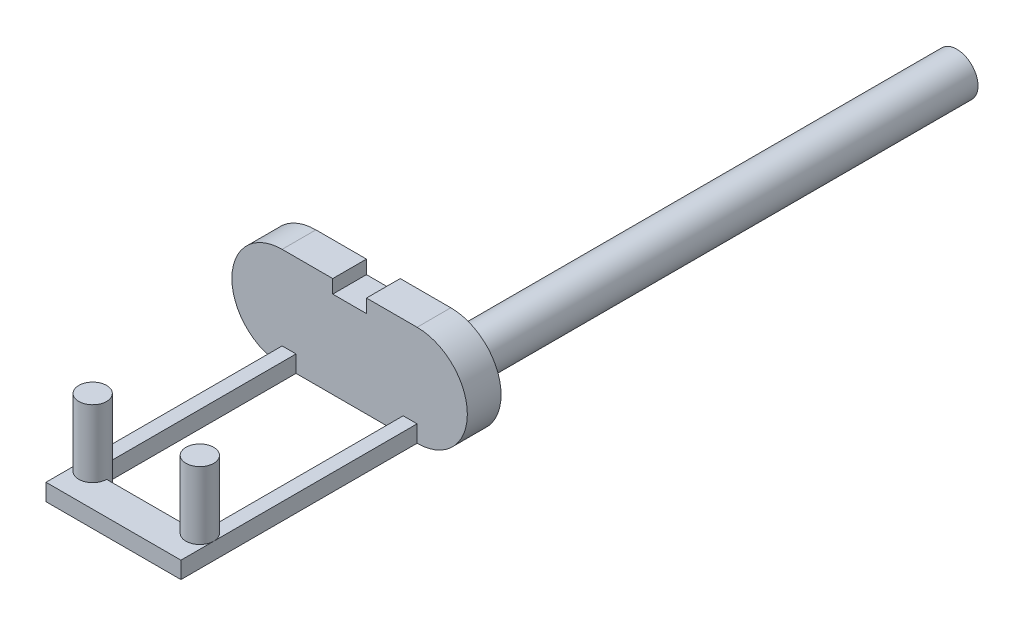
ISO-10303-21;
HEADER;
FILE_DESCRIPTION(('STEP AP214'),'2;1');
FILE_NAME('part.step','',(''),(''),'','','');
FILE_SCHEMA(('AUTOMOTIVE_DESIGN { 1 0 10303 214 1 1 1 1 }'));
ENDSEC;
DATA;
#1=APPLICATION_CONTEXT('core data for automotive mechanical design processes');
#2=APPLICATION_PROTOCOL_DEFINITION('international standard','automotive_design',2000,#1);
#3=PRODUCT_CONTEXT('',#1,'mechanical');
#4=PRODUCT('Part','Part','',(#3));
#5=PRODUCT_RELATED_PRODUCT_CATEGORY('part','',(#4));
#6=PRODUCT_DEFINITION_FORMATION('','',#4);
#7=PRODUCT_DEFINITION_CONTEXT('part definition',#1,'design');
#8=PRODUCT_DEFINITION('design','',#6,#7);
#9=PRODUCT_DEFINITION_SHAPE('','',#8);
#10=(LENGTH_UNIT() NAMED_UNIT(*) SI_UNIT(.MILLI.,.METRE.));
#11=(NAMED_UNIT(*) PLANE_ANGLE_UNIT() SI_UNIT($,.RADIAN.));
#12=(NAMED_UNIT(*) SI_UNIT($,.STERADIAN.) SOLID_ANGLE_UNIT());
#13=UNCERTAINTY_MEASURE_WITH_UNIT(LENGTH_MEASURE(1.E-05),#10,'distance_accuracy_value','');
#14=(GEOMETRIC_REPRESENTATION_CONTEXT(3) GLOBAL_UNCERTAINTY_ASSIGNED_CONTEXT((#13)) GLOBAL_UNIT_ASSIGNED_CONTEXT((#10,
#11,#12)) REPRESENTATION_CONTEXT('',''));
#15=CARTESIAN_POINT('',(0.,0.,0.));
#16=DIRECTION('',(0.,0.,1.));
#17=DIRECTION('',(1.,0.,0.));
#18=AXIS2_PLACEMENT_3D('',#15,#16,#17);
#19=CARTESIAN_POINT('',(-61.2640274636036,57.8352530805438,43.));
#20=DIRECTION('',(0.,-1.,0.));
#21=DIRECTION('',(0.,0.,-1.));
#22=AXIS2_PLACEMENT_3D('',#19,#20,#21);
#23=PLANE('',#22);
#24=DIRECTION('',(-1.,0.,0.));
#25=VECTOR('',#24,1.);
#26=CARTESIAN_POINT('',(-61.2640274636036,57.8352530805438,43.));
#27=LINE('',#26,#25);
#28=CARTESIAN_POINT('',(-73.7640274636036,57.8352530805438,43.));
#29=VERTEX_POINT('',#28);
#30=CARTESIAN_POINT('',(-81.2640274636036,57.8352530805438,43.));
#31=VERTEX_POINT('',#30);
#32=EDGE_CURVE('E187',#29,#31,#27,.T.);
#33=ORIENTED_EDGE('',*,*,#32,.F.);
#34=DIRECTION('',(0.,0.,1.));
#35=VECTOR('',#34,1.);
#36=CARTESIAN_POINT('',(-73.7640274636036,57.8352530805438,30.3857382714521));
#37=LINE('',#36,#35);
#38=CARTESIAN_POINT('',(-73.7640274636036,57.8352530805438,38.));
#39=VERTEX_POINT('',#38);
#40=EDGE_CURVE('E175',#39,#29,#37,.T.);
#41=ORIENTED_EDGE('',*,*,#40,.F.);
#42=DIRECTION('',(-1.,0.,0.));
#43=VECTOR('',#42,1.);
#44=CARTESIAN_POINT('',(-61.2640274636036,57.8352530805438,38.));
#45=LINE('',#44,#43);
#46=CARTESIAN_POINT('',(-81.2640274636036,57.8352530805438,38.));
#47=VERTEX_POINT('',#46);
#48=EDGE_CURVE('E185',#39,#47,#45,.T.);
#49=ORIENTED_EDGE('',*,*,#48,.T.);
#50=DIRECTION('',(0.,0.,-1.));
#51=VECTOR('',#50,1.);
#52=CARTESIAN_POINT('',(-81.2640274636036,57.8352530805438,43.));
#53=LINE('',#52,#51);
#54=EDGE_CURVE('E215',#31,#47,#53,.T.);
#55=ORIENTED_EDGE('',*,*,#54,.F.);
#56=EDGE_LOOP('',(#33,#41,#49,#55));
#57=FACE_BOUND('',#56,.T.);
#58=ADVANCED_FACE('F49',(#57),#23,.F.);
#59=CARTESIAN_POINT('',(0.,45.4390579258131,78.));
#60=DIRECTION('',(0.,1.,0.));
#61=DIRECTION('',(0.,0.,1.));
#62=AXIS2_PLACEMENT_3D('',#59,#60,#61);
#63=PLANE('',#62);
#64=CARTESIAN_POINT('',(-79.2048370431136,45.4390579258131,73.1394620866765));
#65=DIRECTION('',(0.,1.,0.));
#66=DIRECTION('',(0.,0.,1.));
#67=AXIS2_PLACEMENT_3D('',#64,#65,#66);
#68=CIRCLE('',#67,2.0591905457382);
#69=CARTESIAN_POINT('',(-79.2048370431136,45.4390579258131,71.0802715409383));
#70=VERTEX_POINT('',#69);
#71=CARTESIAN_POINT('',(-81.2640275888518,45.4390579258131,73.1394620866765));
#72=VERTEX_POINT('',#71);
#73=EDGE_CURVE('E347',#70,#72,#68,.T.);
#74=ORIENTED_EDGE('',*,*,#73,.F.);
#75=DIRECTION('',(0.,0.,-1.));
#76=VECTOR('',#75,1.);
#77=CARTESIAN_POINT('',(-79.2048370431136,45.4390579258131,78.));
#78=LINE('',#77,#76);
#79=CARTESIAN_POINT('',(-79.2048370431136,45.4390579258131,43.));
#80=VERTEX_POINT('',#79);
#81=EDGE_CURVE('E280',#70,#80,#78,.T.);
#82=ORIENTED_EDGE('',*,*,#81,.T.);
#83=DIRECTION('',(1.,0.,0.));
#84=VECTOR('',#83,1.);
#85=CARTESIAN_POINT('',(0.,45.4390579258131,43.));
#86=LINE('',#85,#84);
#87=CARTESIAN_POINT('',(-81.2640275888518,45.4390579258131,43.));
#88=VERTEX_POINT('',#87);
#89=EDGE_CURVE('E270',#88,#80,#86,.T.);
#90=ORIENTED_EDGE('',*,*,#89,.F.);
#91=DIRECTION('',(0.,0.,-1.));
#92=VECTOR('',#91,1.);
#93=CARTESIAN_POINT('',(-81.2640275888518,45.4390579258131,78.));
#94=LINE('',#93,#92);
#95=EDGE_CURVE('E265',#72,#88,#94,.T.);
#96=ORIENTED_EDGE('',*,*,#95,.F.);
#97=EDGE_LOOP('',(#74,#82,#90,#96));
#98=FACE_BOUND('',#97,.T.);
#99=ADVANCED_FACE('F351',(#98),#63,.T.);
#100=CARTESIAN_POINT('',(-63.3232178840935,45.4390579258131,73.1394620866765));
#101=DIRECTION('',(0.,1.,0.));
#102=DIRECTION('',(0.,0.,1.));
#103=AXIS2_PLACEMENT_3D('',#100,#101,#102);
#104=CIRCLE('',#103,2.05919054573816);
#105=CARTESIAN_POINT('',(-61.2640273383553,45.4390579258131,73.1394620866765));
#106=VERTEX_POINT('',#105);
#107=CARTESIAN_POINT('',(-63.3232178840935,45.4390579258131,71.0802715409384));
#108=VERTEX_POINT('',#107);
#109=EDGE_CURVE('E327',#106,#108,#104,.T.);
#110=ORIENTED_EDGE('',*,*,#109,.F.);
#111=DIRECTION('',(0.,0.,-1.));
#112=VECTOR('',#111,1.);
#113=CARTESIAN_POINT('',(-61.2640273383553,45.4390579258131,78.));
#114=LINE('',#113,#112);
#115=CARTESIAN_POINT('',(-61.2640273383553,45.4390579258131,43.));
#116=VERTEX_POINT('',#115);
#117=EDGE_CURVE('E302',#106,#116,#114,.T.);
#118=ORIENTED_EDGE('',*,*,#117,.T.);
#119=DIRECTION('',(1.,0.,0.));
#120=VECTOR('',#119,1.);
#121=CARTESIAN_POINT('',(0.,45.4390579258131,43.));
#122=LINE('',#121,#120);
#123=CARTESIAN_POINT('',(-63.3232178840935,45.4390579258131,43.));
#124=VERTEX_POINT('',#123);
#125=EDGE_CURVE('E288',#124,#116,#122,.T.);
#126=ORIENTED_EDGE('',*,*,#125,.F.);
#127=DIRECTION('',(0.,0.,-1.));
#128=VECTOR('',#127,1.);
#129=CARTESIAN_POINT('',(-63.3232178840935,45.4390579258131,78.));
#130=LINE('',#129,#128);
#131=EDGE_CURVE('E293',#108,#124,#130,.T.);
#132=ORIENTED_EDGE('',*,*,#131,.F.);
#133=EDGE_LOOP('',(#110,#118,#126,#132));
#134=FACE_BOUND('',#133,.T.);
#135=ADVANCED_FACE('F326',(#134),#63,.T.);
#136=CARTESIAN_POINT('',(-61.2640274636036,50.3871555031784,43.));
#137=DIRECTION('',(0.,0.,1.));
#138=DIRECTION('',(1.,0.,0.));
#139=AXIS2_PLACEMENT_3D('',#136,#137,#138);
#140=PLANE('',#139);
#141=DIRECTION('',(0.,-1.,0.));
#142=VECTOR('',#141,1.);
#143=CARTESIAN_POINT('',(-73.7640274636036,50.3871555031784,43.));
#144=LINE('',#143,#142);
#145=CARTESIAN_POINT('',(-73.7640274636036,55.8352530805438,43.));
#146=VERTEX_POINT('',#145);
#147=EDGE_CURVE('E375',#29,#146,#144,.T.);
#148=ORIENTED_EDGE('',*,*,#147,.F.);
#149=ORIENTED_EDGE('',*,*,#32,.T.);
#150=CARTESIAN_POINT('',(-81.2640274636036,50.3871555031784,43.));
#151=DIRECTION('',(0.,0.,1.));
#152=DIRECTION('',(1.,0.,0.));
#153=AXIS2_PLACEMENT_3D('',#150,#151,#152);
#154=CIRCLE('',#153,7.44809757736534);
#155=CARTESIAN_POINT('',(-81.2640274636036,42.9390579258131,43.));
#156=VERTEX_POINT('',#155);
#157=EDGE_CURVE('E256',#31,#156,#154,.T.);
#158=ORIENTED_EDGE('',*,*,#157,.T.);
#159=DIRECTION('',(0.,1.,0.));
#160=VECTOR('',#159,1.);
#161=CARTESIAN_POINT('',(-81.2640275888518,0.,43.));
#162=LINE('',#161,#160);
#163=EDGE_CURVE('E259',#156,#88,#162,.T.);
#164=ORIENTED_EDGE('',*,*,#163,.T.);
#165=ORIENTED_EDGE('',*,*,#89,.T.);
#166=DIRECTION('',(0.,1.,0.));
#167=VECTOR('',#166,1.);
#168=CARTESIAN_POINT('',(-79.2048370431136,0.,43.));
#169=LINE('',#168,#167);
#170=CARTESIAN_POINT('',(-79.2048370431136,42.9390579258131,43.));
#171=VERTEX_POINT('',#170);
#172=EDGE_CURVE('E273',#171,#80,#169,.T.);
#173=ORIENTED_EDGE('',*,*,#172,.F.);
#174=DIRECTION('',(1.,0.,0.));
#175=VECTOR('',#174,1.);
#176=CARTESIAN_POINT('',(-61.2640274636036,42.9390579258131,43.));
#177=LINE('',#176,#175);
#178=CARTESIAN_POINT('',(-63.3232178840935,42.9390579258131,43.));
#179=VERTEX_POINT('',#178);
#180=EDGE_CURVE('E212',#171,#179,#177,.T.);
#181=ORIENTED_EDGE('',*,*,#180,.T.);
#182=DIRECTION('',(0.,1.,0.));
#183=VECTOR('',#182,1.);
#184=CARTESIAN_POINT('',(-63.3232178840935,0.,43.));
#185=LINE('',#184,#183);
#186=EDGE_CURVE('E284',#179,#124,#185,.T.);
#187=ORIENTED_EDGE('',*,*,#186,.T.);
#188=ORIENTED_EDGE('',*,*,#125,.T.);
#189=DIRECTION('',(0.,1.,0.));
#190=VECTOR('',#189,1.);
#191=CARTESIAN_POINT('',(-61.2640273383553,0.,43.));
#192=LINE('',#191,#190);
#193=CARTESIAN_POINT('',(-61.2640274636036,42.9390579258131,43.));
#194=VERTEX_POINT('',#193);
#195=EDGE_CURVE('E296',#194,#116,#192,.T.);
#196=ORIENTED_EDGE('',*,*,#195,.F.);
#197=CARTESIAN_POINT('',(-61.2640274636036,50.3871555031784,43.));
#198=DIRECTION('',(0.,0.,1.));
#199=DIRECTION('',(1.,0.,0.));
#200=AXIS2_PLACEMENT_3D('',#197,#198,#199);
#201=CIRCLE('',#200,7.44809757736534);
#202=CARTESIAN_POINT('',(-61.2640274636036,57.8352530805438,43.));
#203=VERTEX_POINT('',#202);
#204=EDGE_CURVE('E207',#194,#203,#201,.T.);
#205=ORIENTED_EDGE('',*,*,#204,.T.);
#206=CARTESIAN_POINT('',(-68.7640274636036,57.8352530805438,43.));
#207=VERTEX_POINT('',#206);
#208=EDGE_CURVE('E239',#203,#207,#27,.T.);
#209=ORIENTED_EDGE('',*,*,#208,.T.);
#210=DIRECTION('',(0.,1.,0.));
#211=VECTOR('',#210,1.);
#212=CARTESIAN_POINT('',(-68.7640274636036,50.3871555031784,43.));
#213=LINE('',#212,#211);
#214=CARTESIAN_POINT('',(-68.7640274636036,55.8352530805438,43.));
#215=VERTEX_POINT('',#214);
#216=EDGE_CURVE('E377',#215,#207,#213,.T.);
#217=ORIENTED_EDGE('',*,*,#216,.F.);
#218=DIRECTION('',(1.,0.,0.));
#219=VECTOR('',#218,1.);
#220=CARTESIAN_POINT('',(-61.2640274636036,55.8352530805438,43.));
#221=LINE('',#220,#219);
#222=EDGE_CURVE('E379',#146,#215,#221,.T.);
#223=ORIENTED_EDGE('',*,*,#222,.F.);
#224=EDGE_LOOP('',(#148,#149,#158,#164,#165,#173,#181,#187,#188,#196,#205,#209,#217,#223));
#225=FACE_BOUND('',#224,.T.);
#226=ADVANCED_FACE('F315',(#225),#140,.T.);
#227=CARTESIAN_POINT('',(-61.2640274636036,50.3871555031784,38.));
#228=DIRECTION('',(0.,0.,-1.));
#229=DIRECTION('',(-1.,0.,0.));
#230=AXIS2_PLACEMENT_3D('',#227,#228,#229);
#231=CYLINDRICAL_SURFACE('',#230,3.13544056145611);
#232=CARTESIAN_POINT('',(-61.2640274636036,50.3871555031784,38.));
#233=DIRECTION('',(0.,0.,1.));
#234=DIRECTION('',(1.,0.,0.));
#235=AXIS2_PLACEMENT_3D('',#232,#233,#234);
#236=CIRCLE('',#235,3.13544056145611);
#237=CARTESIAN_POINT('',(-58.1285869021474,50.3871555031784,38.));
#238=VERTEX_POINT('',#237);
#239=EDGE_CURVE('E223',#238,#238,#236,.T.);
#240=ORIENTED_EDGE('',*,*,#239,.F.);
#241=EDGE_LOOP('',(#240));
#242=FACE_BOUND('',#241,.T.);
#243=CARTESIAN_POINT('',(-61.2640274636036,50.3871555031784,-37.));
#244=DIRECTION('',(0.,0.,1.));
#245=DIRECTION('',(1.,0.,0.));
#246=AXIS2_PLACEMENT_3D('',#243,#244,#245);
#247=CIRCLE('',#246,3.13544056145611);
#248=CARTESIAN_POINT('',(-58.1285869021474,50.3871555031784,-37.));
#249=VERTEX_POINT('',#248);
#250=EDGE_CURVE('E220',#249,#249,#247,.T.);
#251=ORIENTED_EDGE('',*,*,#250,.T.);
#252=EDGE_LOOP('',(#251));
#253=FACE_BOUND('',#252,.T.);
#254=ADVANCED_FACE('F51',(#242,#253),#231,.T.);
#255=CARTESIAN_POINT('',(-61.2640274636036,50.3871555031784,-37.));
#256=DIRECTION('',(0.,0.,1.));
#257=DIRECTION('',(1.,0.,0.));
#258=AXIS2_PLACEMENT_3D('',#255,#256,#257);
#259=PLANE('',#258);
#260=ORIENTED_EDGE('',*,*,#250,.F.);
#261=EDGE_LOOP('',(#260));
#262=FACE_BOUND('',#261,.T.);
#263=ADVANCED_FACE('F409',(#262),#259,.F.);
#264=CARTESIAN_POINT('',(-61.2640274636036,50.3871555031784,43.));
#265=DIRECTION('',(0.,0.,-1.));
#266=DIRECTION('',(-1.,0.,0.));
#267=AXIS2_PLACEMENT_3D('',#264,#265,#266);
#268=CYLINDRICAL_SURFACE('',#267,7.44809757736534);
#269=CARTESIAN_POINT('',(-61.2640274636036,50.3871555031784,38.));
#270=DIRECTION('',(0.,0.,1.));
#271=DIRECTION('',(1.,0.,0.));
#272=AXIS2_PLACEMENT_3D('',#269,#270,#271);
#273=CIRCLE('',#272,7.44809757736534);
#274=CARTESIAN_POINT('',(-61.2640274636036,42.9390579258131,38.));
#275=VERTEX_POINT('',#274);
#276=CARTESIAN_POINT('',(-61.2640274636036,57.8352530805438,38.));
#277=VERTEX_POINT('',#276);
#278=EDGE_CURVE('E196',#275,#277,#273,.T.);
#279=ORIENTED_EDGE('',*,*,#278,.T.);
#280=DIRECTION('',(0.,0.,-1.));
#281=VECTOR('',#280,1.);
#282=CARTESIAN_POINT('',(-61.2640274636036,57.8352530805438,43.));
#283=LINE('',#282,#281);
#284=EDGE_CURVE('E217',#203,#277,#283,.T.);
#285=ORIENTED_EDGE('',*,*,#284,.F.);
#286=ORIENTED_EDGE('',*,*,#204,.F.);
#287=DIRECTION('',(0.,0.,-1.));
#288=VECTOR('',#287,1.);
#289=CARTESIAN_POINT('',(-61.2640274636036,42.9390579258131,43.));
#290=LINE('',#289,#288);
#291=EDGE_CURVE('E208',#194,#275,#290,.T.);
#292=ORIENTED_EDGE('',*,*,#291,.T.);
#293=EDGE_LOOP('',(#279,#285,#286,#292));
#294=FACE_BOUND('',#293,.T.);
#295=ADVANCED_FACE('F243',(#294),#268,.T.);
#296=CARTESIAN_POINT('',(-68.7640274636036,57.8352530805438,38.));
#297=VERTEX_POINT('',#296);
#298=EDGE_CURVE('E195',#277,#297,#45,.T.);
#299=ORIENTED_EDGE('',*,*,#298,.T.);
#300=DIRECTION('',(0.,0.,-1.));
#301=VECTOR('',#300,1.);
#302=CARTESIAN_POINT('',(-68.7640274636036,57.8352530805438,30.3857382714521));
#303=LINE('',#302,#301);
#304=EDGE_CURVE('E188',#207,#297,#303,.T.);
#305=ORIENTED_EDGE('',*,*,#304,.F.);
#306=ORIENTED_EDGE('',*,*,#208,.F.);
#307=ORIENTED_EDGE('',*,*,#284,.T.);
#308=EDGE_LOOP('',(#299,#305,#306,#307));
#309=FACE_BOUND('',#308,.T.);
#310=ADVANCED_FACE('F236',(#309),#23,.F.);
#311=CARTESIAN_POINT('',(-81.2640274636036,50.3871555031784,43.));
#312=DIRECTION('',(0.,0.,-1.));
#313=DIRECTION('',(-1.,0.,0.));
#314=AXIS2_PLACEMENT_3D('',#311,#312,#313);
#315=CYLINDRICAL_SURFACE('',#314,7.44809757736534);
#316=CARTESIAN_POINT('',(-81.2640274636036,50.3871555031784,38.));
#317=DIRECTION('',(0.,0.,1.));
#318=DIRECTION('',(1.,0.,0.));
#319=AXIS2_PLACEMENT_3D('',#316,#317,#318);
#320=CIRCLE('',#319,7.44809757736534);
#321=CARTESIAN_POINT('',(-81.2640274636036,42.9390579258131,38.));
#322=VERTEX_POINT('',#321);
#323=EDGE_CURVE('E194',#47,#322,#320,.T.);
#324=ORIENTED_EDGE('',*,*,#323,.T.);
#325=DIRECTION('',(0.,0.,-1.));
#326=VECTOR('',#325,1.);
#327=CARTESIAN_POINT('',(-81.2640274636036,42.9390579258131,43.));
#328=LINE('',#327,#326);
#329=EDGE_CURVE('E211',#156,#322,#328,.T.);
#330=ORIENTED_EDGE('',*,*,#329,.F.);
#331=ORIENTED_EDGE('',*,*,#157,.F.);
#332=ORIENTED_EDGE('',*,*,#54,.T.);
#333=EDGE_LOOP('',(#324,#330,#331,#332));
#334=FACE_BOUND('',#333,.T.);
#335=ADVANCED_FACE('F255',(#334),#315,.T.);
#336=CARTESIAN_POINT('',(-61.2640274636036,42.9390579258131,43.));
#337=DIRECTION('',(0.,1.,0.));
#338=DIRECTION('',(0.,0.,1.));
#339=AXIS2_PLACEMENT_3D('',#336,#337,#338);
#340=PLANE('',#339);
#341=DIRECTION('',(0.,0.,-1.));
#342=VECTOR('',#341,1.);
#343=CARTESIAN_POINT('',(-81.2640274636036,42.9390579258131,78.));
#344=LINE('',#343,#342);
#345=CARTESIAN_POINT('',(-81.2640274636036,42.9390579258131,78.));
#346=VERTEX_POINT('',#345);
#347=EDGE_CURVE('E250',#346,#156,#344,.T.);
#348=ORIENTED_EDGE('',*,*,#347,.T.);
#349=ORIENTED_EDGE('',*,*,#329,.T.);
#350=DIRECTION('',(1.,0.,0.));
#351=VECTOR('',#350,1.);
#352=CARTESIAN_POINT('',(-61.2640274636036,42.9390579258131,38.));
#353=LINE('',#352,#351);
#354=EDGE_CURVE('E205',#322,#275,#353,.T.);
#355=ORIENTED_EDGE('',*,*,#354,.T.);
#356=ORIENTED_EDGE('',*,*,#291,.F.);
#357=DIRECTION('',(0.,0.,-1.));
#358=VECTOR('',#357,1.);
#359=CARTESIAN_POINT('',(-61.2640274636036,42.9390579258131,78.));
#360=LINE('',#359,#358);
#361=CARTESIAN_POINT('',(-61.2640274636036,42.9390579258131,78.));
#362=VERTEX_POINT('',#361);
#363=EDGE_CURVE('E306',#362,#194,#360,.T.);
#364=ORIENTED_EDGE('',*,*,#363,.F.);
#365=DIRECTION('',(1.,0.,0.));
#366=VECTOR('',#365,1.);
#367=CARTESIAN_POINT('',(0.,42.9390579258131,78.));
#368=LINE('',#367,#366);
#369=EDGE_CURVE('E285',#346,#362,#368,.T.);
#370=ORIENTED_EDGE('',*,*,#369,.F.);
#371=EDGE_LOOP('',(#348,#349,#355,#356,#364,#370));
#372=FACE_BOUND('',#371,.T.);
#373=DIRECTION('',(0.,0.,-1.));
#374=VECTOR('',#373,1.);
#375=CARTESIAN_POINT('',(-79.2048370431136,42.9390579258131,78.));
#376=LINE('',#375,#374);
#377=CARTESIAN_POINT('',(-79.2048370431136,42.9390579258131,71.0802715409383));
#378=VERTEX_POINT('',#377);
#379=EDGE_CURVE('E282',#378,#171,#376,.T.);
#380=ORIENTED_EDGE('',*,*,#379,.F.);
#381=CARTESIAN_POINT('',(-79.2048370431136,42.9390579258131,73.1394620866765));
#382=DIRECTION('',(0.,1.,0.));
#383=DIRECTION('',(0.,0.,1.));
#384=AXIS2_PLACEMENT_3D('',#381,#382,#383);
#385=CIRCLE('',#384,2.0591905457382);
#386=CARTESIAN_POINT('',(-77.1456464973754,42.9390579258131,73.1394620866765));
#387=VERTEX_POINT('',#386);
#388=EDGE_CURVE('E72',#378,#387,#385,.F.);
#389=ORIENTED_EDGE('',*,*,#388,.T.);
#390=DIRECTION('',(1.,0.,0.));
#391=VECTOR('',#390,1.);
#392=CARTESIAN_POINT('',(-61.2640273383553,42.9390579258131,73.1394620866765));
#393=LINE('',#392,#391);
#394=CARTESIAN_POINT('',(-65.3824084298317,42.9390579258131,73.1394620866765));
#395=VERTEX_POINT('',#394);
#396=EDGE_CURVE('E356',#387,#395,#393,.T.);
#397=ORIENTED_EDGE('',*,*,#396,.T.);
#398=CARTESIAN_POINT('',(-63.3232178840935,42.9390579258131,73.1394620866765));
#399=DIRECTION('',(0.,1.,0.));
#400=DIRECTION('',(0.,0.,1.));
#401=AXIS2_PLACEMENT_3D('',#398,#399,#400);
#402=CIRCLE('',#401,2.05919054573816);
#403=CARTESIAN_POINT('',(-63.3232178840935,42.9390579258131,71.0802715409384));
#404=VERTEX_POINT('',#403);
#405=EDGE_CURVE('E363',#395,#404,#402,.F.);
#406=ORIENTED_EDGE('',*,*,#405,.T.);
#407=DIRECTION('',(0.,0.,-1.));
#408=VECTOR('',#407,1.);
#409=CARTESIAN_POINT('',(-63.3232178840935,42.9390579258131,78.));
#410=LINE('',#409,#408);
#411=EDGE_CURVE('E200',#404,#179,#410,.T.);
#412=ORIENTED_EDGE('',*,*,#411,.T.);
#413=ORIENTED_EDGE('',*,*,#180,.F.);
#414=EDGE_LOOP('',(#380,#389,#397,#406,#412,#413));
#415=FACE_BOUND('',#414,.T.);
#416=ADVANCED_FACE('F246',(#372,#415),#340,.F.);
#417=CARTESIAN_POINT('',(-61.2640274636036,50.3871555031784,38.));
#418=DIRECTION('',(0.,0.,1.));
#419=DIRECTION('',(1.,0.,0.));
#420=AXIS2_PLACEMENT_3D('',#417,#418,#419);
#421=PLANE('',#420);
#422=ORIENTED_EDGE('',*,*,#48,.F.);
#423=DIRECTION('',(0.,-1.,0.));
#424=VECTOR('',#423,1.);
#425=CARTESIAN_POINT('',(-73.7640274636036,50.3871555031784,38.));
#426=LINE('',#425,#424);
#427=CARTESIAN_POINT('',(-73.7640274636036,55.8352530805438,38.));
#428=VERTEX_POINT('',#427);
#429=EDGE_CURVE('E13',#39,#428,#426,.T.);
#430=ORIENTED_EDGE('',*,*,#429,.T.);
#431=DIRECTION('',(1.,0.,0.));
#432=VECTOR('',#431,1.);
#433=CARTESIAN_POINT('',(-61.2640274636036,55.8352530805438,38.));
#434=LINE('',#433,#432);
#435=CARTESIAN_POINT('',(-68.7640274636036,55.8352530805438,38.));
#436=VERTEX_POINT('',#435);
#437=EDGE_CURVE('E230',#428,#436,#434,.T.);
#438=ORIENTED_EDGE('',*,*,#437,.T.);
#439=DIRECTION('',(0.,1.,0.));
#440=VECTOR('',#439,1.);
#441=CARTESIAN_POINT('',(-68.7640274636036,50.3871555031784,38.));
#442=LINE('',#441,#440);
#443=EDGE_CURVE('E57',#436,#297,#442,.T.);
#444=ORIENTED_EDGE('',*,*,#443,.T.);
#445=ORIENTED_EDGE('',*,*,#298,.F.);
#446=ORIENTED_EDGE('',*,*,#278,.F.);
#447=ORIENTED_EDGE('',*,*,#354,.F.);
#448=ORIENTED_EDGE('',*,*,#323,.F.);
#449=EDGE_LOOP('',(#422,#430,#438,#444,#445,#446,#447,#448));
#450=FACE_BOUND('',#449,.T.);
#451=ORIENTED_EDGE('',*,*,#239,.T.);
#452=EDGE_LOOP('',(#451));
#453=FACE_BOUND('',#452,.T.);
#454=ADVANCED_FACE('F191',(#450,#453),#421,.F.);
#455=CARTESIAN_POINT('',(-63.3232178840935,0.,78.));
#456=DIRECTION('',(-1.,0.,0.));
#457=DIRECTION('',(0.,0.,1.));
#458=AXIS2_PLACEMENT_3D('',#455,#456,#457);
#459=PLANE('',#458);
#460=DIRECTION('',(0.,1.,0.));
#461=VECTOR('',#460,1.);
#462=CARTESIAN_POINT('',(-63.3232178840935,37.1147875312263,71.0802715409384));
#463=LINE('',#462,#461);
#464=EDGE_CURVE('E323',#108,#404,#463,.F.);
#465=ORIENTED_EDGE('',*,*,#464,.F.);
#466=ORIENTED_EDGE('',*,*,#131,.T.);
#467=ORIENTED_EDGE('',*,*,#186,.F.);
#468=ORIENTED_EDGE('',*,*,#411,.F.);
#469=EDGE_LOOP('',(#465,#466,#467,#468));
#470=FACE_BOUND('',#469,.T.);
#471=ADVANCED_FACE('F321',(#470),#459,.T.);
#472=CARTESIAN_POINT('',(-61.2640273383553,0.,78.));
#473=DIRECTION('',(-1.,0.,0.));
#474=DIRECTION('',(0.,0.,1.));
#475=AXIS2_PLACEMENT_3D('',#472,#473,#474);
#476=PLANE('',#475);
#477=ORIENTED_EDGE('',*,*,#363,.T.);
#478=ORIENTED_EDGE('',*,*,#195,.T.);
#479=ORIENTED_EDGE('',*,*,#117,.F.);
#480=CARTESIAN_POINT('',(-61.2640273383553,45.4390579258131,78.));
#481=VERTEX_POINT('',#480);
#482=EDGE_CURVE('E303',#481,#106,#114,.T.);
#483=ORIENTED_EDGE('',*,*,#482,.F.);
#484=DIRECTION('',(0.,1.,0.));
#485=VECTOR('',#484,1.);
#486=CARTESIAN_POINT('',(-61.2640273383553,0.,78.));
#487=LINE('',#486,#485);
#488=EDGE_CURVE('E287',#362,#481,#487,.T.);
#489=ORIENTED_EDGE('',*,*,#488,.F.);
#490=EDGE_LOOP('',(#477,#478,#479,#483,#489));
#491=FACE_BOUND('',#490,.T.);
#492=ADVANCED_FACE('F331',(#491),#476,.F.);
#493=CARTESIAN_POINT('',(-77.1456464973754,45.4390579258131,73.1394620866765));
#494=VERTEX_POINT('',#493);
#495=EDGE_CURVE('E341',#72,#494,#68,.T.);
#496=ORIENTED_EDGE('',*,*,#495,.F.);
#497=CARTESIAN_POINT('',(-81.2640275888518,45.4390579258131,78.));
#498=VERTEX_POINT('',#497);
#499=EDGE_CURVE('E278',#498,#72,#94,.T.);
#500=ORIENTED_EDGE('',*,*,#499,.F.);
#501=DIRECTION('',(1.,0.,0.));
#502=VECTOR('',#501,1.);
#503=CARTESIAN_POINT('',(0.,45.4390579258131,78.));
#504=LINE('',#503,#502);
#505=EDGE_CURVE('E290',#498,#481,#504,.T.);
#506=ORIENTED_EDGE('',*,*,#505,.T.);
#507=ORIENTED_EDGE('',*,*,#482,.T.);
#508=CARTESIAN_POINT('',(-65.3824084298317,45.4390579258131,73.1394620866765));
#509=VERTEX_POINT('',#508);
#510=EDGE_CURVE('E361',#509,#106,#104,.T.);
#511=ORIENTED_EDGE('',*,*,#510,.F.);
#512=DIRECTION('',(-1.,0.,0.));
#513=VECTOR('',#512,1.);
#514=CARTESIAN_POINT('',(-61.2640273383553,45.4390579258131,73.1394620866765));
#515=LINE('',#514,#513);
#516=EDGE_CURVE('E344',#509,#494,#515,.T.);
#517=ORIENTED_EDGE('',*,*,#516,.T.);
#518=EDGE_LOOP('',(#496,#500,#506,#507,#511,#517));
#519=FACE_BOUND('',#518,.T.);
#520=ADVANCED_FACE('F339',(#519),#63,.T.);
#521=CARTESIAN_POINT('',(0.,0.,78.));
#522=DIRECTION('',(0.,0.,1.));
#523=DIRECTION('',(1.,0.,0.));
#524=AXIS2_PLACEMENT_3D('',#521,#522,#523);
#525=PLANE('',#524);
#526=ORIENTED_EDGE('',*,*,#505,.F.);
#527=DIRECTION('',(0.,1.,0.));
#528=VECTOR('',#527,1.);
#529=CARTESIAN_POINT('',(-81.2640275888518,0.,78.));
#530=LINE('',#529,#528);
#531=EDGE_CURVE('E269',#346,#498,#530,.T.);
#532=ORIENTED_EDGE('',*,*,#531,.F.);
#533=ORIENTED_EDGE('',*,*,#369,.T.);
#534=ORIENTED_EDGE('',*,*,#488,.T.);
#535=EDGE_LOOP('',(#526,#532,#533,#534));
#536=FACE_BOUND('',#535,.T.);
#537=ADVANCED_FACE('F335',(#536),#525,.T.);
#538=CARTESIAN_POINT('',(-79.2048370431136,0.,78.));
#539=DIRECTION('',(-1.,0.,0.));
#540=DIRECTION('',(0.,0.,1.));
#541=AXIS2_PLACEMENT_3D('',#538,#539,#540);
#542=PLANE('',#541);
#543=ORIENTED_EDGE('',*,*,#81,.F.);
#544=DIRECTION('',(0.,1.,0.));
#545=VECTOR('',#544,1.);
#546=CARTESIAN_POINT('',(-79.2048370431136,37.1147875312263,71.0802715409383));
#547=LINE('',#546,#545);
#548=EDGE_CURVE('E369',#70,#378,#547,.F.);
#549=ORIENTED_EDGE('',*,*,#548,.T.);
#550=ORIENTED_EDGE('',*,*,#379,.T.);
#551=ORIENTED_EDGE('',*,*,#172,.T.);
#552=EDGE_LOOP('',(#543,#549,#550,#551));
#553=FACE_BOUND('',#552,.T.);
#554=ADVANCED_FACE('F354',(#553),#542,.F.);
#555=CARTESIAN_POINT('',(-81.2640275888518,0.,78.));
#556=DIRECTION('',(-1.,0.,0.));
#557=DIRECTION('',(0.,0.,1.));
#558=AXIS2_PLACEMENT_3D('',#555,#556,#557);
#559=PLANE('',#558);
#560=ORIENTED_EDGE('',*,*,#499,.T.);
#561=ORIENTED_EDGE('',*,*,#95,.T.);
#562=ORIENTED_EDGE('',*,*,#163,.F.);
#563=ORIENTED_EDGE('',*,*,#347,.F.);
#564=ORIENTED_EDGE('',*,*,#531,.T.);
#565=EDGE_LOOP('',(#560,#561,#562,#563,#564));
#566=FACE_BOUND('',#565,.T.);
#567=ADVANCED_FACE('F261',(#566),#559,.T.);
#568=CARTESIAN_POINT('',(-61.2640273383553,22.3569093784259,73.1394620866765));
#569=DIRECTION('',(0.,0.,-1.));
#570=DIRECTION('',(-1.,0.,0.));
#571=AXIS2_PLACEMENT_3D('',#568,#569,#570);
#572=PLANE('',#571);
#573=DIRECTION('',(0.,1.,0.));
#574=VECTOR('',#573,1.);
#575=CARTESIAN_POINT('',(-77.1456464973754,37.1147875312263,73.1394620866765));
#576=LINE('',#575,#574);
#577=EDGE_CURVE('E228',#494,#387,#576,.F.);
#578=ORIENTED_EDGE('',*,*,#577,.F.);
#579=ORIENTED_EDGE('',*,*,#516,.F.);
#580=DIRECTION('',(0.,1.,0.));
#581=VECTOR('',#580,1.);
#582=CARTESIAN_POINT('',(-65.3824084298317,37.1147875312263,73.1394620866765));
#583=LINE('',#582,#581);
#584=EDGE_CURVE('E226',#395,#509,#583,.T.);
#585=ORIENTED_EDGE('',*,*,#584,.F.);
#586=ORIENTED_EDGE('',*,*,#396,.F.);
#587=EDGE_LOOP('',(#578,#579,#585,#586));
#588=FACE_BOUND('',#587,.T.);
#589=ADVANCED_FACE('F443',(#588),#572,.T.);
#590=CARTESIAN_POINT('',(-63.3232178840935,37.1147875312263,73.1394620866765));
#591=DIRECTION('',(0.,1.,0.));
#592=DIRECTION('',(0.,0.,1.));
#593=AXIS2_PLACEMENT_3D('',#590,#591,#592);
#594=CYLINDRICAL_SURFACE('',#593,2.05919054573816);
#595=ORIENTED_EDGE('',*,*,#109,.T.);
#596=ORIENTED_EDGE('',*,*,#464,.T.);
#597=ORIENTED_EDGE('',*,*,#405,.F.);
#598=ORIENTED_EDGE('',*,*,#584,.T.);
#599=ORIENTED_EDGE('',*,*,#510,.T.);
#600=EDGE_LOOP('',(#595,#596,#597,#598,#599));
#601=FACE_BOUND('',#600,.T.);
#602=CARTESIAN_POINT('',(-63.3232178840935,55.4390579258131,73.1394620866765));
#603=DIRECTION('',(0.,1.,0.));
#604=DIRECTION('',(0.,0.,1.));
#605=AXIS2_PLACEMENT_3D('',#602,#603,#604);
#606=CIRCLE('',#605,2.05919054573816);
#607=CARTESIAN_POINT('',(-63.3232178840935,55.4390579258131,75.1986526324147));
#608=VERTEX_POINT('',#607);
#609=EDGE_CURVE('E366',#608,#608,#606,.T.);
#610=ORIENTED_EDGE('',*,*,#609,.F.);
#611=EDGE_LOOP('',(#610));
#612=FACE_BOUND('',#611,.T.);
#613=ADVANCED_FACE('F446',(#601,#612),#594,.T.);
#614=CARTESIAN_POINT('',(-63.3232178840935,55.4390579258131,73.1394620866765));
#615=DIRECTION('',(0.,1.,0.));
#616=DIRECTION('',(0.,0.,1.));
#617=AXIS2_PLACEMENT_3D('',#614,#615,#616);
#618=PLANE('',#617);
#619=ORIENTED_EDGE('',*,*,#609,.T.);
#620=EDGE_LOOP('',(#619));
#621=FACE_BOUND('',#620,.T.);
#622=ADVANCED_FACE('F450',(#621),#618,.T.);
#623=CARTESIAN_POINT('',(-79.2048370431136,37.1147875312263,73.1394620866765));
#624=DIRECTION('',(0.,1.,0.));
#625=DIRECTION('',(0.,0.,1.));
#626=AXIS2_PLACEMENT_3D('',#623,#624,#625);
#627=CYLINDRICAL_SURFACE('',#626,2.0591905457382);
#628=CARTESIAN_POINT('',(-79.2048370431136,55.4390579258131,73.1394620866765));
#629=DIRECTION('',(0.,1.,0.));
#630=DIRECTION('',(0.,0.,1.));
#631=AXIS2_PLACEMENT_3D('',#628,#629,#630);
#632=CIRCLE('',#631,2.0591905457382);
#633=CARTESIAN_POINT('',(-79.2048370431136,55.4390579258131,75.1986526324147));
#634=VERTEX_POINT('',#633);
#635=EDGE_CURVE('E372',#634,#634,#632,.T.);
#636=ORIENTED_EDGE('',*,*,#635,.F.);
#637=EDGE_LOOP('',(#636));
#638=FACE_BOUND('',#637,.T.);
#639=ORIENTED_EDGE('',*,*,#548,.F.);
#640=ORIENTED_EDGE('',*,*,#73,.T.);
#641=ORIENTED_EDGE('',*,*,#495,.T.);
#642=ORIENTED_EDGE('',*,*,#577,.T.);
#643=ORIENTED_EDGE('',*,*,#388,.F.);
#644=EDGE_LOOP('',(#639,#640,#641,#642,#643));
#645=FACE_BOUND('',#644,.T.);
#646=ADVANCED_FACE('F454',(#638,#645),#627,.T.);
#647=CARTESIAN_POINT('',(-79.2048370431136,55.4390579258131,73.1394620866765));
#648=DIRECTION('',(0.,1.,0.));
#649=DIRECTION('',(0.,0.,1.));
#650=AXIS2_PLACEMENT_3D('',#647,#648,#649);
#651=PLANE('',#650);
#652=ORIENTED_EDGE('',*,*,#635,.T.);
#653=EDGE_LOOP('',(#652));
#654=FACE_BOUND('',#653,.T.);
#655=ADVANCED_FACE('F394',(#654),#651,.T.);
#656=CARTESIAN_POINT('',(-73.7640274636036,55.8352530805438,30.3857382714521));
#657=DIRECTION('',(-1.,0.,0.));
#658=DIRECTION('',(0.,0.,1.));
#659=AXIS2_PLACEMENT_3D('',#656,#657,#658);
#660=PLANE('',#659);
#661=ORIENTED_EDGE('',*,*,#147,.T.);
#662=DIRECTION('',(0.,0.,1.));
#663=VECTOR('',#662,1.);
#664=CARTESIAN_POINT('',(-73.7640274636036,55.8352530805438,30.3857382714521));
#665=LINE('',#664,#663);
#666=EDGE_CURVE('E178',#428,#146,#665,.T.);
#667=ORIENTED_EDGE('',*,*,#666,.F.);
#668=ORIENTED_EDGE('',*,*,#429,.F.);
#669=ORIENTED_EDGE('',*,*,#40,.T.);
#670=EDGE_LOOP('',(#661,#667,#668,#669));
#671=FACE_BOUND('',#670,.T.);
#672=ADVANCED_FACE('F174',(#671),#660,.F.);
#673=CARTESIAN_POINT('',(-68.7640274636036,55.8352530805438,30.3857382714521));
#674=DIRECTION('',(1.,0.,0.));
#675=DIRECTION('',(0.,0.,-1.));
#676=AXIS2_PLACEMENT_3D('',#673,#674,#675);
#677=PLANE('',#676);
#678=ORIENTED_EDGE('',*,*,#216,.T.);
#679=ORIENTED_EDGE('',*,*,#304,.T.);
#680=ORIENTED_EDGE('',*,*,#443,.F.);
#681=DIRECTION('',(0.,0.,-1.));
#682=VECTOR('',#681,1.);
#683=CARTESIAN_POINT('',(-68.7640274636036,55.8352530805438,30.3857382714521));
#684=LINE('',#683,#682);
#685=EDGE_CURVE('E64',#215,#436,#684,.T.);
#686=ORIENTED_EDGE('',*,*,#685,.F.);
#687=EDGE_LOOP('',(#678,#679,#680,#686));
#688=FACE_BOUND('',#687,.T.);
#689=ADVANCED_FACE('F386',(#688),#677,.F.);
#690=CARTESIAN_POINT('',(0.,55.8352530805438,0.));
#691=DIRECTION('',(0.,-1.,0.));
#692=DIRECTION('',(0.,0.,-1.));
#693=AXIS2_PLACEMENT_3D('',#690,#691,#692);
#694=PLANE('',#693);
#695=ORIENTED_EDGE('',*,*,#222,.T.);
#696=ORIENTED_EDGE('',*,*,#685,.T.);
#697=ORIENTED_EDGE('',*,*,#437,.F.);
#698=ORIENTED_EDGE('',*,*,#666,.T.);
#699=EDGE_LOOP('',(#695,#696,#697,#698));
#700=FACE_BOUND('',#699,.T.);
#701=ADVANCED_FACE('F384',(#700),#694,.F.);
#702=CLOSED_SHELL('',(#58,#99,#135,#226,#254,#263,#295,#310,#335,#416,#454,#471,#492,#520,#537,
#554,#567,#589,#613,#622,#646,#655,#672,#689,#701));
#703=MANIFOLD_SOLID_BREP('B2',#702);
#704=ADVANCED_BREP_SHAPE_REPRESENTATION('',(#18,#703),#14);
#705=SHAPE_DEFINITION_REPRESENTATION(#9,#704);
ENDSEC;
END-ISO-10303-21;
